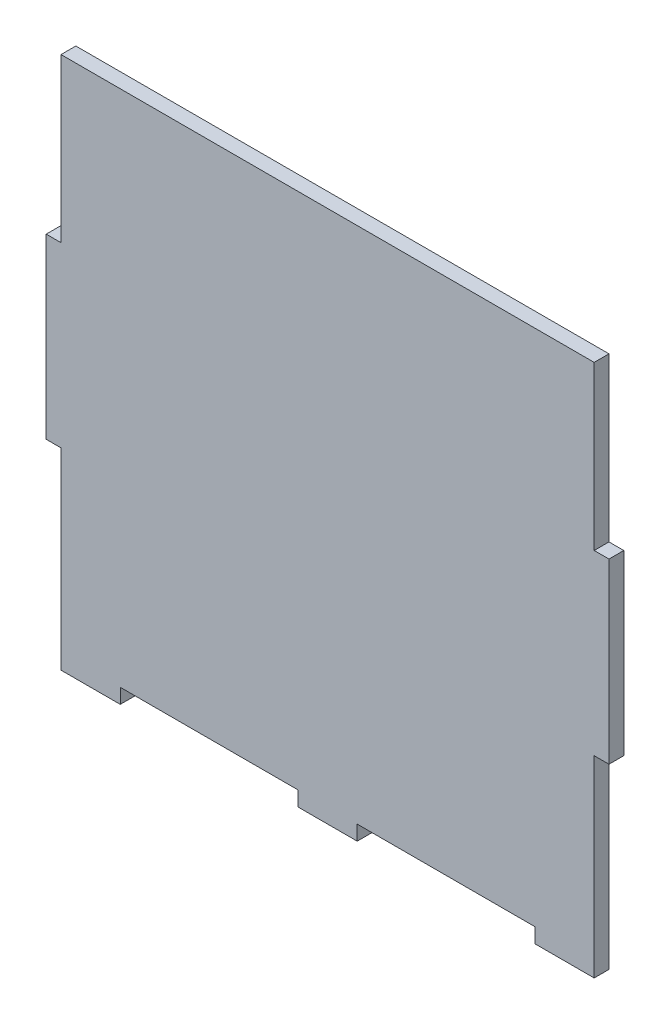
ISO-10303-21;
HEADER;
FILE_DESCRIPTION(('STEP AP214'),'2;1');
FILE_NAME('part.step','',(''),(''),'','','');
FILE_SCHEMA(('AUTOMOTIVE_DESIGN { 1 0 10303 214 1 1 1 1 }'));
ENDSEC;
DATA;
#1=APPLICATION_CONTEXT('core data for automotive mechanical design processes');
#2=APPLICATION_PROTOCOL_DEFINITION('international standard','automotive_design',2000,#1);
#3=PRODUCT_CONTEXT('',#1,'mechanical');
#4=PRODUCT('Part','Part','',(#3));
#5=PRODUCT_RELATED_PRODUCT_CATEGORY('part','',(#4));
#6=PRODUCT_DEFINITION_FORMATION('','',#4);
#7=PRODUCT_DEFINITION_CONTEXT('part definition',#1,'design');
#8=PRODUCT_DEFINITION('design','',#6,#7);
#9=PRODUCT_DEFINITION_SHAPE('','',#8);
#10=(LENGTH_UNIT() NAMED_UNIT(*) SI_UNIT(.MILLI.,.METRE.));
#11=(NAMED_UNIT(*) PLANE_ANGLE_UNIT() SI_UNIT($,.RADIAN.));
#12=(NAMED_UNIT(*) SI_UNIT($,.STERADIAN.) SOLID_ANGLE_UNIT());
#13=UNCERTAINTY_MEASURE_WITH_UNIT(LENGTH_MEASURE(1.E-05),#10,'distance_accuracy_value','');
#14=(GEOMETRIC_REPRESENTATION_CONTEXT(3) GLOBAL_UNCERTAINTY_ASSIGNED_CONTEXT((#13)) GLOBAL_UNIT_ASSIGNED_CONTEXT((#10,
#11,#12)) REPRESENTATION_CONTEXT('',''));
#15=CARTESIAN_POINT('',(0.,0.,0.));
#16=DIRECTION('',(0.,0.,1.));
#17=DIRECTION('',(1.,0.,0.));
#18=AXIS2_PLACEMENT_3D('',#15,#16,#17);
#19=CARTESIAN_POINT('',(0.,-47.38624,6.35));
#20=DIRECTION('',(0.,-1.,0.));
#21=DIRECTION('',(1.,0.,0.));
#22=AXIS2_PLACEMENT_3D('',#19,#20,#21);
#23=PLANE('',#22);
#24=DIRECTION('',(-1.,0.,0.));
#25=VECTOR('',#24,1.);
#26=CARTESIAN_POINT('',(0.,-47.38624,0.));
#27=LINE('',#26,#25);
#28=CARTESIAN_POINT('',(118.491,-47.3862400000001,0.));
#29=VERTEX_POINT('',#28);
#30=CARTESIAN_POINT('',(93.091,-47.3862400000001,0.));
#31=VERTEX_POINT('',#30);
#32=EDGE_CURVE('E203',#29,#31,#27,.T.);
#33=ORIENTED_EDGE('',*,*,#32,.F.);
#34=DIRECTION('',(0.,0.,-1.));
#35=VECTOR('',#34,1.);
#36=CARTESIAN_POINT('',(118.491,-47.3862400000001,6.35));
#37=LINE('',#36,#35);
#38=CARTESIAN_POINT('',(118.491,-47.3862400000001,6.35));
#39=VERTEX_POINT('',#38);
#40=EDGE_CURVE('E11',#39,#29,#37,.T.);
#41=ORIENTED_EDGE('',*,*,#40,.F.);
#42=DIRECTION('',(-1.,0.,0.));
#43=VECTOR('',#42,1.);
#44=CARTESIAN_POINT('',(0.,-47.38624,6.35));
#45=LINE('',#44,#43);
#46=CARTESIAN_POINT('',(93.091,-47.3862400000001,6.35));
#47=VERTEX_POINT('',#46);
#48=EDGE_CURVE('E250',#39,#47,#45,.T.);
#49=ORIENTED_EDGE('',*,*,#48,.T.);
#50=DIRECTION('',(0.,0.,-1.));
#51=VECTOR('',#50,1.);
#52=CARTESIAN_POINT('',(93.091,-47.3862400000001,6.35));
#53=LINE('',#52,#51);
#54=EDGE_CURVE('E53',#47,#31,#53,.T.);
#55=ORIENTED_EDGE('',*,*,#54,.T.);
#56=EDGE_LOOP('',(#33,#41,#49,#55));
#57=FACE_BOUND('',#56,.T.);
#58=ADVANCED_FACE('F37',(#57),#23,.T.);
#59=CARTESIAN_POINT('',(118.491,0.,6.35));
#60=DIRECTION('',(1.,0.,0.));
#61=DIRECTION('',(0.,1.,0.));
#62=AXIS2_PLACEMENT_3D('',#59,#60,#61);
#63=PLANE('',#62);
#64=DIRECTION('',(0.,-1.,0.));
#65=VECTOR('',#64,1.);
#66=CARTESIAN_POINT('',(118.491,0.,0.));
#67=LINE('',#66,#65);
#68=CARTESIAN_POINT('',(118.491,35.16376,0.));
#69=VERTEX_POINT('',#68);
#70=EDGE_CURVE('E205',#69,#29,#67,.T.);
#71=ORIENTED_EDGE('',*,*,#70,.F.);
#72=DIRECTION('',(0.,0.,-1.));
#73=VECTOR('',#72,1.);
#74=CARTESIAN_POINT('',(118.491,35.16376,6.35));
#75=LINE('',#74,#73);
#76=CARTESIAN_POINT('',(118.491,35.16376,6.35));
#77=VERTEX_POINT('',#76);
#78=EDGE_CURVE('E45',#77,#69,#75,.T.);
#79=ORIENTED_EDGE('',*,*,#78,.F.);
#80=DIRECTION('',(0.,-1.,0.));
#81=VECTOR('',#80,1.);
#82=CARTESIAN_POINT('',(118.491,0.,6.35));
#83=LINE('',#82,#81);
#84=EDGE_CURVE('E308',#77,#39,#83,.T.);
#85=ORIENTED_EDGE('',*,*,#84,.T.);
#86=ORIENTED_EDGE('',*,*,#40,.T.);
#87=EDGE_LOOP('',(#71,#79,#85,#86));
#88=FACE_BOUND('',#87,.T.);
#89=ADVANCED_FACE('F296',(#88),#63,.T.);
#90=CARTESIAN_POINT('',(0.,35.16376,6.35));
#91=DIRECTION('',(0.,-1.,0.));
#92=DIRECTION('',(0.,0.,-1.));
#93=AXIS2_PLACEMENT_3D('',#90,#91,#92);
#94=PLANE('',#93);
#95=DIRECTION('',(-1.,0.,0.));
#96=VECTOR('',#95,1.);
#97=CARTESIAN_POINT('',(0.,35.16376,0.));
#98=LINE('',#97,#96);
#99=CARTESIAN_POINT('',(124.841,35.16376,0.));
#100=VERTEX_POINT('',#99);
#101=EDGE_CURVE('E208',#100,#69,#98,.T.);
#102=ORIENTED_EDGE('',*,*,#101,.F.);
#103=DIRECTION('',(0.,0.,-1.));
#104=VECTOR('',#103,1.);
#105=CARTESIAN_POINT('',(124.841,35.16376,6.35));
#106=LINE('',#105,#104);
#107=CARTESIAN_POINT('',(124.841,35.16376,6.35));
#108=VERTEX_POINT('',#107);
#109=EDGE_CURVE('E285',#108,#100,#106,.T.);
#110=ORIENTED_EDGE('',*,*,#109,.F.);
#111=DIRECTION('',(-1.,0.,0.));
#112=VECTOR('',#111,1.);
#113=CARTESIAN_POINT('',(0.,35.16376,6.35));
#114=LINE('',#113,#112);
#115=EDGE_CURVE('E292',#108,#77,#114,.T.);
#116=ORIENTED_EDGE('',*,*,#115,.T.);
#117=ORIENTED_EDGE('',*,*,#78,.T.);
#118=EDGE_LOOP('',(#102,#110,#116,#117));
#119=FACE_BOUND('',#118,.T.);
#120=ADVANCED_FACE('F290',(#119),#94,.T.);
#121=CARTESIAN_POINT('',(124.841,0.,6.35));
#122=DIRECTION('',(1.,0.,0.));
#123=DIRECTION('',(0.,1.,0.));
#124=AXIS2_PLACEMENT_3D('',#121,#122,#123);
#125=PLANE('',#124);
#126=DIRECTION('',(0.,-1.,0.));
#127=VECTOR('',#126,1.);
#128=CARTESIAN_POINT('',(124.841,0.,0.));
#129=LINE('',#128,#127);
#130=CARTESIAN_POINT('',(124.841,111.36376,0.));
#131=VERTEX_POINT('',#130);
#132=EDGE_CURVE('E212',#131,#100,#129,.T.);
#133=ORIENTED_EDGE('',*,*,#132,.F.);
#134=DIRECTION('',(0.,0.,-1.));
#135=VECTOR('',#134,1.);
#136=CARTESIAN_POINT('',(124.841,111.36376,6.35));
#137=LINE('',#136,#135);
#138=CARTESIAN_POINT('',(124.841,111.36376,6.35));
#139=VERTEX_POINT('',#138);
#140=EDGE_CURVE('E283',#139,#131,#137,.T.);
#141=ORIENTED_EDGE('',*,*,#140,.F.);
#142=DIRECTION('',(0.,-1.,0.));
#143=VECTOR('',#142,1.);
#144=CARTESIAN_POINT('',(124.841,0.,6.35));
#145=LINE('',#144,#143);
#146=EDGE_CURVE('E307',#139,#108,#145,.T.);
#147=ORIENTED_EDGE('',*,*,#146,.T.);
#148=ORIENTED_EDGE('',*,*,#109,.T.);
#149=EDGE_LOOP('',(#133,#141,#147,#148));
#150=FACE_BOUND('',#149,.T.);
#151=ADVANCED_FACE('F303',(#150),#125,.T.);
#152=CARTESIAN_POINT('',(0.,111.36376,6.35));
#153=DIRECTION('',(0.,-1.,0.));
#154=DIRECTION('',(0.,0.,-1.));
#155=AXIS2_PLACEMENT_3D('',#152,#153,#154);
#156=PLANE('',#155);
#157=DIRECTION('',(-1.,0.,0.));
#158=VECTOR('',#157,1.);
#159=CARTESIAN_POINT('',(0.,111.36376,0.));
#160=LINE('',#159,#158);
#161=CARTESIAN_POINT('',(118.491,111.36376,0.));
#162=VERTEX_POINT('',#161);
#163=EDGE_CURVE('E215',#131,#162,#160,.T.);
#164=ORIENTED_EDGE('',*,*,#163,.T.);
#165=DIRECTION('',(0.,0.,-1.));
#166=VECTOR('',#165,1.);
#167=CARTESIAN_POINT('',(118.491,111.36376,6.35));
#168=LINE('',#167,#166);
#169=CARTESIAN_POINT('',(118.491,111.36376,6.35));
#170=VERTEX_POINT('',#169);
#171=EDGE_CURVE('E281',#170,#162,#168,.T.);
#172=ORIENTED_EDGE('',*,*,#171,.F.);
#173=DIRECTION('',(-1.,0.,0.));
#174=VECTOR('',#173,1.);
#175=CARTESIAN_POINT('',(0.,111.36376,6.35));
#176=LINE('',#175,#174);
#177=EDGE_CURVE('E310',#139,#170,#176,.T.);
#178=ORIENTED_EDGE('',*,*,#177,.F.);
#179=ORIENTED_EDGE('',*,*,#140,.T.);
#180=EDGE_LOOP('',(#164,#172,#178,#179));
#181=FACE_BOUND('',#180,.T.);
#182=ADVANCED_FACE('F509',(#181),#156,.F.);
#183=CARTESIAN_POINT('',(118.491,181.21376,0.));
#184=VERTEX_POINT('',#183);
#185=EDGE_CURVE('E209',#184,#162,#67,.T.);
#186=ORIENTED_EDGE('',*,*,#185,.F.);
#187=DIRECTION('',(0.,0.,-1.));
#188=VECTOR('',#187,1.);
#189=CARTESIAN_POINT('',(118.491,181.21376,6.35));
#190=LINE('',#189,#188);
#191=CARTESIAN_POINT('',(118.491,181.21376,6.35));
#192=VERTEX_POINT('',#191);
#193=EDGE_CURVE('E279',#192,#184,#190,.T.);
#194=ORIENTED_EDGE('',*,*,#193,.F.);
#195=EDGE_CURVE('E313',#192,#170,#83,.T.);
#196=ORIENTED_EDGE('',*,*,#195,.T.);
#197=ORIENTED_EDGE('',*,*,#171,.T.);
#198=EDGE_LOOP('',(#186,#194,#196,#197));
#199=FACE_BOUND('',#198,.T.);
#200=ADVANCED_FACE('F365',(#199),#63,.T.);
#201=CARTESIAN_POINT('',(0.,181.21376,6.35));
#202=DIRECTION('',(0.,1.,0.));
#203=DIRECTION('',(0.,0.,1.));
#204=AXIS2_PLACEMENT_3D('',#201,#202,#203);
#205=PLANE('',#204);
#206=DIRECTION('',(1.,0.,0.));
#207=VECTOR('',#206,1.);
#208=CARTESIAN_POINT('',(0.,181.21376,0.));
#209=LINE('',#208,#207);
#210=CARTESIAN_POINT('',(-110.109,181.21376,0.));
#211=VERTEX_POINT('',#210);
#212=EDGE_CURVE('E218',#211,#184,#209,.T.);
#213=ORIENTED_EDGE('',*,*,#212,.F.);
#214=DIRECTION('',(0.,0.,-1.));
#215=VECTOR('',#214,1.);
#216=CARTESIAN_POINT('',(-110.109,181.21376,6.35));
#217=LINE('',#216,#215);
#218=CARTESIAN_POINT('',(-110.109,181.21376,6.35));
#219=VERTEX_POINT('',#218);
#220=EDGE_CURVE('E277',#219,#211,#217,.T.);
#221=ORIENTED_EDGE('',*,*,#220,.F.);
#222=DIRECTION('',(1.,0.,0.));
#223=VECTOR('',#222,1.);
#224=CARTESIAN_POINT('',(0.,181.21376,6.35));
#225=LINE('',#224,#223);
#226=EDGE_CURVE('E317',#219,#192,#225,.T.);
#227=ORIENTED_EDGE('',*,*,#226,.T.);
#228=ORIENTED_EDGE('',*,*,#193,.T.);
#229=EDGE_LOOP('',(#213,#221,#227,#228));
#230=FACE_BOUND('',#229,.T.);
#231=ADVANCED_FACE('F491',(#230),#205,.T.);
#232=CARTESIAN_POINT('',(-110.109,0.,6.35));
#233=DIRECTION('',(1.,0.,0.));
#234=DIRECTION('',(0.,1.,0.));
#235=AXIS2_PLACEMENT_3D('',#232,#233,#234);
#236=PLANE('',#235);
#237=DIRECTION('',(0.,-1.,0.));
#238=VECTOR('',#237,1.);
#239=CARTESIAN_POINT('',(-110.109,0.,0.));
#240=LINE('',#239,#238);
#241=CARTESIAN_POINT('',(-110.109,111.36376,0.));
#242=VERTEX_POINT('',#241);
#243=EDGE_CURVE('E221',#211,#242,#240,.T.);
#244=ORIENTED_EDGE('',*,*,#243,.T.);
#245=DIRECTION('',(0.,0.,-1.));
#246=VECTOR('',#245,1.);
#247=CARTESIAN_POINT('',(-110.109,111.36376,6.35));
#248=LINE('',#247,#246);
#249=CARTESIAN_POINT('',(-110.109,111.36376,6.35));
#250=VERTEX_POINT('',#249);
#251=EDGE_CURVE('E275',#250,#242,#248,.T.);
#252=ORIENTED_EDGE('',*,*,#251,.F.);
#253=DIRECTION('',(0.,-1.,0.));
#254=VECTOR('',#253,1.);
#255=CARTESIAN_POINT('',(-110.109,0.,6.35));
#256=LINE('',#255,#254);
#257=EDGE_CURVE('E320',#219,#250,#256,.T.);
#258=ORIENTED_EDGE('',*,*,#257,.F.);
#259=ORIENTED_EDGE('',*,*,#220,.T.);
#260=EDGE_LOOP('',(#244,#252,#258,#259));
#261=FACE_BOUND('',#260,.T.);
#262=ADVANCED_FACE('F454',(#261),#236,.F.);
#263=CARTESIAN_POINT('',(0.,111.36376,6.35));
#264=DIRECTION('',(0.,1.,0.));
#265=DIRECTION('',(0.,0.,1.));
#266=AXIS2_PLACEMENT_3D('',#263,#264,#265);
#267=PLANE('',#266);
#268=DIRECTION('',(1.,0.,0.));
#269=VECTOR('',#268,1.);
#270=CARTESIAN_POINT('',(0.,111.36376,0.));
#271=LINE('',#270,#269);
#272=CARTESIAN_POINT('',(-116.459,111.36376,0.));
#273=VERTEX_POINT('',#272);
#274=EDGE_CURVE('E224',#273,#242,#271,.T.);
#275=ORIENTED_EDGE('',*,*,#274,.F.);
#276=DIRECTION('',(0.,0.,-1.));
#277=VECTOR('',#276,1.);
#278=CARTESIAN_POINT('',(-116.459,111.36376,6.35));
#279=LINE('',#278,#277);
#280=CARTESIAN_POINT('',(-116.459,111.36376,6.35));
#281=VERTEX_POINT('',#280);
#282=EDGE_CURVE('E273',#281,#273,#279,.T.);
#283=ORIENTED_EDGE('',*,*,#282,.F.);
#284=DIRECTION('',(1.,0.,0.));
#285=VECTOR('',#284,1.);
#286=CARTESIAN_POINT('',(0.,111.36376,6.35));
#287=LINE('',#286,#285);
#288=EDGE_CURVE('E322',#281,#250,#287,.T.);
#289=ORIENTED_EDGE('',*,*,#288,.T.);
#290=ORIENTED_EDGE('',*,*,#251,.T.);
#291=EDGE_LOOP('',(#275,#283,#289,#290));
#292=FACE_BOUND('',#291,.T.);
#293=ADVANCED_FACE('F472',(#292),#267,.T.);
#294=CARTESIAN_POINT('',(-116.459,0.,6.35));
#295=DIRECTION('',(1.,0.,0.));
#296=DIRECTION('',(0.,1.,0.));
#297=AXIS2_PLACEMENT_3D('',#294,#295,#296);
#298=PLANE('',#297);
#299=DIRECTION('',(0.,-1.,0.));
#300=VECTOR('',#299,1.);
#301=CARTESIAN_POINT('',(-116.459,0.,0.));
#302=LINE('',#301,#300);
#303=CARTESIAN_POINT('',(-116.459,35.1637599999999,0.));
#304=VERTEX_POINT('',#303);
#305=EDGE_CURVE('E228',#273,#304,#302,.T.);
#306=ORIENTED_EDGE('',*,*,#305,.T.);
#307=DIRECTION('',(0.,0.,-1.));
#308=VECTOR('',#307,1.);
#309=CARTESIAN_POINT('',(-116.459,35.1637599999999,6.35));
#310=LINE('',#309,#308);
#311=CARTESIAN_POINT('',(-116.459,35.1637599999999,6.35));
#312=VERTEX_POINT('',#311);
#313=EDGE_CURVE('E270',#312,#304,#310,.T.);
#314=ORIENTED_EDGE('',*,*,#313,.F.);
#315=DIRECTION('',(0.,-1.,0.));
#316=VECTOR('',#315,1.);
#317=CARTESIAN_POINT('',(-116.459,0.,6.35));
#318=LINE('',#317,#316);
#319=EDGE_CURVE('E326',#281,#312,#318,.T.);
#320=ORIENTED_EDGE('',*,*,#319,.F.);
#321=ORIENTED_EDGE('',*,*,#282,.T.);
#322=EDGE_LOOP('',(#306,#314,#320,#321));
#323=FACE_BOUND('',#322,.T.);
#324=ADVANCED_FACE('F462',(#323),#298,.F.);
#325=CARTESIAN_POINT('',(0.,35.1637599999999,6.35));
#326=DIRECTION('',(0.,1.,0.));
#327=DIRECTION('',(0.,0.,1.));
#328=AXIS2_PLACEMENT_3D('',#325,#326,#327);
#329=PLANE('',#328);
#330=DIRECTION('',(1.,0.,0.));
#331=VECTOR('',#330,1.);
#332=CARTESIAN_POINT('',(0.,35.1637599999999,0.));
#333=LINE('',#332,#331);
#334=CARTESIAN_POINT('',(-110.109,35.1637599999999,0.));
#335=VERTEX_POINT('',#334);
#336=EDGE_CURVE('E230',#304,#335,#333,.T.);
#337=ORIENTED_EDGE('',*,*,#336,.T.);
#338=DIRECTION('',(0.,0.,-1.));
#339=VECTOR('',#338,1.);
#340=CARTESIAN_POINT('',(-110.109,35.1637599999999,6.35));
#341=LINE('',#340,#339);
#342=CARTESIAN_POINT('',(-110.109,35.1637599999999,6.35));
#343=VERTEX_POINT('',#342);
#344=EDGE_CURVE('E267',#343,#335,#341,.T.);
#345=ORIENTED_EDGE('',*,*,#344,.F.);
#346=DIRECTION('',(1.,0.,0.));
#347=VECTOR('',#346,1.);
#348=CARTESIAN_POINT('',(0.,35.1637599999999,6.35));
#349=LINE('',#348,#347);
#350=EDGE_CURVE('E328',#312,#343,#349,.T.);
#351=ORIENTED_EDGE('',*,*,#350,.F.);
#352=ORIENTED_EDGE('',*,*,#313,.T.);
#353=EDGE_LOOP('',(#337,#345,#351,#352));
#354=FACE_BOUND('',#353,.T.);
#355=ADVANCED_FACE('F451',(#354),#329,.F.);
#356=CARTESIAN_POINT('',(-110.109,-47.3862400000001,0.));
#357=VERTEX_POINT('',#356);
#358=EDGE_CURVE('E225',#335,#357,#240,.T.);
#359=ORIENTED_EDGE('',*,*,#358,.T.);
#360=DIRECTION('',(0.,0.,-1.));
#361=VECTOR('',#360,1.);
#362=CARTESIAN_POINT('',(-110.109,-47.3862400000001,6.35));
#363=LINE('',#362,#361);
#364=CARTESIAN_POINT('',(-110.109,-47.3862400000001,6.35));
#365=VERTEX_POINT('',#364);
#366=EDGE_CURVE('E264',#365,#357,#363,.T.);
#367=ORIENTED_EDGE('',*,*,#366,.F.);
#368=EDGE_CURVE('E323',#343,#365,#256,.T.);
#369=ORIENTED_EDGE('',*,*,#368,.F.);
#370=ORIENTED_EDGE('',*,*,#344,.T.);
#371=EDGE_LOOP('',(#359,#367,#369,#370));
#372=FACE_BOUND('',#371,.T.);
#373=ADVANCED_FACE('F441',(#372),#236,.F.);
#374=CARTESIAN_POINT('',(0.,-47.3862400000001,6.35));
#375=DIRECTION('',(0.,1.,0.));
#376=DIRECTION('',(0.,0.,1.));
#377=AXIS2_PLACEMENT_3D('',#374,#375,#376);
#378=PLANE('',#377);
#379=DIRECTION('',(1.,0.,0.));
#380=VECTOR('',#379,1.);
#381=CARTESIAN_POINT('',(0.,-47.3862400000001,0.));
#382=LINE('',#381,#380);
#383=CARTESIAN_POINT('',(-84.709,-47.3862400000001,0.));
#384=VERTEX_POINT('',#383);
#385=EDGE_CURVE('E232',#357,#384,#382,.T.);
#386=ORIENTED_EDGE('',*,*,#385,.T.);
#387=DIRECTION('',(0.,0.,-1.));
#388=VECTOR('',#387,1.);
#389=CARTESIAN_POINT('',(-84.709,-47.3862400000001,6.35));
#390=LINE('',#389,#388);
#391=CARTESIAN_POINT('',(-84.709,-47.3862400000001,6.35));
#392=VERTEX_POINT('',#391);
#393=EDGE_CURVE('E261',#392,#384,#390,.T.);
#394=ORIENTED_EDGE('',*,*,#393,.F.);
#395=DIRECTION('',(1.,0.,0.));
#396=VECTOR('',#395,1.);
#397=CARTESIAN_POINT('',(0.,-47.3862400000001,6.35));
#398=LINE('',#397,#396);
#399=EDGE_CURVE('E330',#365,#392,#398,.T.);
#400=ORIENTED_EDGE('',*,*,#399,.F.);
#401=ORIENTED_EDGE('',*,*,#366,.T.);
#402=EDGE_LOOP('',(#386,#394,#400,#401));
#403=FACE_BOUND('',#402,.T.);
#404=ADVANCED_FACE('F431',(#403),#378,.F.);
#405=CARTESIAN_POINT('',(-84.709,0.,6.35));
#406=DIRECTION('',(-1.,0.,0.));
#407=DIRECTION('',(0.,0.,1.));
#408=AXIS2_PLACEMENT_3D('',#405,#406,#407);
#409=PLANE('',#408);
#410=DIRECTION('',(0.,1.,0.));
#411=VECTOR('',#410,1.);
#412=CARTESIAN_POINT('',(-84.709,0.,0.));
#413=LINE('',#412,#411);
#414=CARTESIAN_POINT('',(-84.709,-41.0362400000001,0.));
#415=VERTEX_POINT('',#414);
#416=EDGE_CURVE('E234',#384,#415,#413,.T.);
#417=ORIENTED_EDGE('',*,*,#416,.T.);
#418=DIRECTION('',(0.,0.,-1.));
#419=VECTOR('',#418,1.);
#420=CARTESIAN_POINT('',(-84.709,-41.0362400000001,6.35));
#421=LINE('',#420,#419);
#422=CARTESIAN_POINT('',(-84.709,-41.0362400000001,6.35));
#423=VERTEX_POINT('',#422);
#424=EDGE_CURVE('E258',#423,#415,#421,.T.);
#425=ORIENTED_EDGE('',*,*,#424,.F.);
#426=DIRECTION('',(0.,1.,0.));
#427=VECTOR('',#426,1.);
#428=CARTESIAN_POINT('',(-84.709,0.,6.35));
#429=LINE('',#428,#427);
#430=EDGE_CURVE('E332',#392,#423,#429,.T.);
#431=ORIENTED_EDGE('',*,*,#430,.F.);
#432=ORIENTED_EDGE('',*,*,#393,.T.);
#433=EDGE_LOOP('',(#417,#425,#431,#432));
#434=FACE_BOUND('',#433,.T.);
#435=ADVANCED_FACE('F422',(#434),#409,.F.);
#436=CARTESIAN_POINT('',(0.,-41.0362400000001,6.35));
#437=DIRECTION('',(0.,1.,0.));
#438=DIRECTION('',(0.,0.,1.));
#439=AXIS2_PLACEMENT_3D('',#436,#437,#438);
#440=PLANE('',#439);
#441=DIRECTION('',(1.,0.,0.));
#442=VECTOR('',#441,1.);
#443=CARTESIAN_POINT('',(0.,-41.0362400000001,0.));
#444=LINE('',#443,#442);
#445=CARTESIAN_POINT('',(-8.509,-41.0362400000001,0.));
#446=VERTEX_POINT('',#445);
#447=EDGE_CURVE('E236',#415,#446,#444,.T.);
#448=ORIENTED_EDGE('',*,*,#447,.T.);
#449=DIRECTION('',(0.,0.,-1.));
#450=VECTOR('',#449,1.);
#451=CARTESIAN_POINT('',(-8.509,-41.0362400000001,6.35));
#452=LINE('',#451,#450);
#453=CARTESIAN_POINT('',(-8.509,-41.0362400000001,6.35));
#454=VERTEX_POINT('',#453);
#455=EDGE_CURVE('E256',#454,#446,#452,.T.);
#456=ORIENTED_EDGE('',*,*,#455,.F.);
#457=DIRECTION('',(1.,0.,0.));
#458=VECTOR('',#457,1.);
#459=CARTESIAN_POINT('',(0.,-41.0362400000001,6.35));
#460=LINE('',#459,#458);
#461=EDGE_CURVE('E334',#423,#454,#460,.T.);
#462=ORIENTED_EDGE('',*,*,#461,.F.);
#463=ORIENTED_EDGE('',*,*,#424,.T.);
#464=EDGE_LOOP('',(#448,#456,#462,#463));
#465=FACE_BOUND('',#464,.T.);
#466=ADVANCED_FACE('F346',(#465),#440,.F.);
#467=CARTESIAN_POINT('',(-8.50900000000001,0.,6.35));
#468=DIRECTION('',(-1.,0.,0.));
#469=DIRECTION('',(0.,-1.,0.));
#470=AXIS2_PLACEMENT_3D('',#467,#468,#469);
#471=PLANE('',#470);
#472=DIRECTION('',(0.,1.,0.));
#473=VECTOR('',#472,1.);
#474=CARTESIAN_POINT('',(-8.50900000000001,0.,0.));
#475=LINE('',#474,#473);
#476=CARTESIAN_POINT('',(-8.509,-47.38624,0.));
#477=VERTEX_POINT('',#476);
#478=EDGE_CURVE('E239',#477,#446,#475,.T.);
#479=ORIENTED_EDGE('',*,*,#478,.F.);
#480=DIRECTION('',(0.,0.,-1.));
#481=VECTOR('',#480,1.);
#482=CARTESIAN_POINT('',(-8.509,-47.38624,6.35));
#483=LINE('',#482,#481);
#484=CARTESIAN_POINT('',(-8.509,-47.38624,6.35));
#485=VERTEX_POINT('',#484);
#486=EDGE_CURVE('E254',#485,#477,#483,.T.);
#487=ORIENTED_EDGE('',*,*,#486,.F.);
#488=DIRECTION('',(0.,1.,0.));
#489=VECTOR('',#488,1.);
#490=CARTESIAN_POINT('',(-8.50900000000001,0.,6.35));
#491=LINE('',#490,#489);
#492=EDGE_CURVE('E336',#485,#454,#491,.T.);
#493=ORIENTED_EDGE('',*,*,#492,.T.);
#494=ORIENTED_EDGE('',*,*,#455,.T.);
#495=EDGE_LOOP('',(#479,#487,#493,#494));
#496=FACE_BOUND('',#495,.T.);
#497=ADVANCED_FACE('F340',(#496),#471,.T.);
#498=CARTESIAN_POINT('',(0.,-47.38624,6.35));
#499=DIRECTION('',(0.,1.,0.));
#500=DIRECTION('',(0.,0.,1.));
#501=AXIS2_PLACEMENT_3D('',#498,#499,#500);
#502=PLANE('',#501);
#503=DIRECTION('',(1.,0.,0.));
#504=VECTOR('',#503,1.);
#505=CARTESIAN_POINT('',(0.,-47.38624,0.));
#506=LINE('',#505,#504);
#507=CARTESIAN_POINT('',(16.891,-47.38624,0.));
#508=VERTEX_POINT('',#507);
#509=EDGE_CURVE('E242',#477,#508,#506,.T.);
#510=ORIENTED_EDGE('',*,*,#509,.T.);
#511=DIRECTION('',(0.,0.,-1.));
#512=VECTOR('',#511,1.);
#513=CARTESIAN_POINT('',(16.891,-47.38624,6.35));
#514=LINE('',#513,#512);
#515=CARTESIAN_POINT('',(16.891,-47.38624,6.35));
#516=VERTEX_POINT('',#515);
#517=EDGE_CURVE('E195',#516,#508,#514,.T.);
#518=ORIENTED_EDGE('',*,*,#517,.F.);
#519=DIRECTION('',(1.,0.,0.));
#520=VECTOR('',#519,1.);
#521=CARTESIAN_POINT('',(0.,-47.38624,6.35));
#522=LINE('',#521,#520);
#523=EDGE_CURVE('E183',#485,#516,#522,.T.);
#524=ORIENTED_EDGE('',*,*,#523,.F.);
#525=ORIENTED_EDGE('',*,*,#486,.T.);
#526=EDGE_LOOP('',(#510,#518,#524,#525));
#527=FACE_BOUND('',#526,.T.);
#528=ADVANCED_FACE('F351',(#527),#502,.F.);
#529=CARTESIAN_POINT('',(16.891,0.,6.35));
#530=DIRECTION('',(-1.,0.,0.));
#531=DIRECTION('',(0.,0.,1.));
#532=AXIS2_PLACEMENT_3D('',#529,#530,#531);
#533=PLANE('',#532);
#534=DIRECTION('',(0.,1.,0.));
#535=VECTOR('',#534,1.);
#536=CARTESIAN_POINT('',(16.891,0.,0.));
#537=LINE('',#536,#535);
#538=CARTESIAN_POINT('',(16.891,-41.0362400000001,0.));
#539=VERTEX_POINT('',#538);
#540=EDGE_CURVE('E192',#508,#539,#537,.T.);
#541=ORIENTED_EDGE('',*,*,#540,.T.);
#542=DIRECTION('',(0.,0.,-1.));
#543=VECTOR('',#542,1.);
#544=CARTESIAN_POINT('',(16.891,-41.0362400000001,6.35));
#545=LINE('',#544,#543);
#546=CARTESIAN_POINT('',(16.891,-41.0362400000001,6.35));
#547=VERTEX_POINT('',#546);
#548=EDGE_CURVE('E189',#547,#539,#545,.T.);
#549=ORIENTED_EDGE('',*,*,#548,.F.);
#550=DIRECTION('',(0.,1.,0.));
#551=VECTOR('',#550,1.);
#552=CARTESIAN_POINT('',(16.891,0.,6.35));
#553=LINE('',#552,#551);
#554=EDGE_CURVE('E175',#516,#547,#553,.T.);
#555=ORIENTED_EDGE('',*,*,#554,.F.);
#556=ORIENTED_EDGE('',*,*,#517,.T.);
#557=EDGE_LOOP('',(#541,#549,#555,#556));
#558=FACE_BOUND('',#557,.T.);
#559=ADVANCED_FACE('F190',(#558),#533,.F.);
#560=CARTESIAN_POINT('',(0.,-41.0362400000001,6.35));
#561=DIRECTION('',(0.,-1.,0.));
#562=DIRECTION('',(0.,0.,-1.));
#563=AXIS2_PLACEMENT_3D('',#560,#561,#562);
#564=PLANE('',#563);
#565=DIRECTION('',(-1.,0.,0.));
#566=VECTOR('',#565,1.);
#567=CARTESIAN_POINT('',(0.,-41.0362400000001,0.));
#568=LINE('',#567,#566);
#569=CARTESIAN_POINT('',(93.091,-41.0362400000001,0.));
#570=VERTEX_POINT('',#569);
#571=EDGE_CURVE('E245',#570,#539,#568,.T.);
#572=ORIENTED_EDGE('',*,*,#571,.F.);
#573=DIRECTION('',(0.,0.,-1.));
#574=VECTOR('',#573,1.);
#575=CARTESIAN_POINT('',(93.091,-41.0362400000001,6.35));
#576=LINE('',#575,#574);
#577=CARTESIAN_POINT('',(93.091,-41.0362400000001,6.35));
#578=VERTEX_POINT('',#577);
#579=EDGE_CURVE('E114',#578,#570,#576,.T.);
#580=ORIENTED_EDGE('',*,*,#579,.F.);
#581=DIRECTION('',(-1.,0.,0.));
#582=VECTOR('',#581,1.);
#583=CARTESIAN_POINT('',(0.,-41.0362400000001,6.35));
#584=LINE('',#583,#582);
#585=EDGE_CURVE('E180',#578,#547,#584,.T.);
#586=ORIENTED_EDGE('',*,*,#585,.T.);
#587=ORIENTED_EDGE('',*,*,#548,.T.);
#588=EDGE_LOOP('',(#572,#580,#586,#587));
#589=FACE_BOUND('',#588,.T.);
#590=ADVANCED_FACE('F197',(#589),#564,.T.);
#591=CARTESIAN_POINT('',(93.091,0.,6.35));
#592=DIRECTION('',(-1.,0.,0.));
#593=DIRECTION('',(0.,0.,1.));
#594=AXIS2_PLACEMENT_3D('',#591,#592,#593);
#595=PLANE('',#594);
#596=DIRECTION('',(0.,1.,0.));
#597=VECTOR('',#596,1.);
#598=CARTESIAN_POINT('',(93.091,0.,0.));
#599=LINE('',#598,#597);
#600=EDGE_CURVE('E247',#31,#570,#599,.T.);
#601=ORIENTED_EDGE('',*,*,#600,.F.);
#602=ORIENTED_EDGE('',*,*,#54,.F.);
#603=DIRECTION('',(0.,1.,0.));
#604=VECTOR('',#603,1.);
#605=CARTESIAN_POINT('',(93.091,0.,6.35));
#606=LINE('',#605,#604);
#607=EDGE_CURVE('E198',#47,#578,#606,.T.);
#608=ORIENTED_EDGE('',*,*,#607,.T.);
#609=ORIENTED_EDGE('',*,*,#579,.T.);
#610=EDGE_LOOP('',(#601,#602,#608,#609));
#611=FACE_BOUND('',#610,.T.);
#612=ADVANCED_FACE('F366',(#611),#595,.T.);
#613=CARTESIAN_POINT('',(0.,0.,6.35));
#614=DIRECTION('',(0.,0.,1.));
#615=DIRECTION('',(1.,0.,0.));
#616=AXIS2_PLACEMENT_3D('',#613,#614,#615);
#617=PLANE('',#616);
#618=ORIENTED_EDGE('',*,*,#48,.F.);
#619=ORIENTED_EDGE('',*,*,#84,.F.);
#620=ORIENTED_EDGE('',*,*,#115,.F.);
#621=ORIENTED_EDGE('',*,*,#146,.F.);
#622=ORIENTED_EDGE('',*,*,#177,.T.);
#623=ORIENTED_EDGE('',*,*,#195,.F.);
#624=ORIENTED_EDGE('',*,*,#226,.F.);
#625=ORIENTED_EDGE('',*,*,#257,.T.);
#626=ORIENTED_EDGE('',*,*,#288,.F.);
#627=ORIENTED_EDGE('',*,*,#319,.T.);
#628=ORIENTED_EDGE('',*,*,#350,.T.);
#629=ORIENTED_EDGE('',*,*,#368,.T.);
#630=ORIENTED_EDGE('',*,*,#399,.T.);
#631=ORIENTED_EDGE('',*,*,#430,.T.);
#632=ORIENTED_EDGE('',*,*,#461,.T.);
#633=ORIENTED_EDGE('',*,*,#492,.F.);
#634=ORIENTED_EDGE('',*,*,#523,.T.);
#635=ORIENTED_EDGE('',*,*,#554,.T.);
#636=ORIENTED_EDGE('',*,*,#585,.F.);
#637=ORIENTED_EDGE('',*,*,#607,.F.);
#638=EDGE_LOOP('',(#618,#619,#620,#621,#622,#623,#624,#625,#626,#627,#628,#629,#630,#631,#632,
#633,#634,#635,#636,#637));
#639=FACE_BOUND('',#638,.T.);
#640=ADVANCED_FACE('F177',(#639),#617,.T.);
#641=CARTESIAN_POINT('',(0.,0.,0.));
#642=DIRECTION('',(0.,0.,1.));
#643=DIRECTION('',(1.,0.,0.));
#644=AXIS2_PLACEMENT_3D('',#641,#642,#643);
#645=PLANE('',#644);
#646=ORIENTED_EDGE('',*,*,#32,.T.);
#647=ORIENTED_EDGE('',*,*,#600,.T.);
#648=ORIENTED_EDGE('',*,*,#571,.T.);
#649=ORIENTED_EDGE('',*,*,#540,.F.);
#650=ORIENTED_EDGE('',*,*,#509,.F.);
#651=ORIENTED_EDGE('',*,*,#478,.T.);
#652=ORIENTED_EDGE('',*,*,#447,.F.);
#653=ORIENTED_EDGE('',*,*,#416,.F.);
#654=ORIENTED_EDGE('',*,*,#385,.F.);
#655=ORIENTED_EDGE('',*,*,#358,.F.);
#656=ORIENTED_EDGE('',*,*,#336,.F.);
#657=ORIENTED_EDGE('',*,*,#305,.F.);
#658=ORIENTED_EDGE('',*,*,#274,.T.);
#659=ORIENTED_EDGE('',*,*,#243,.F.);
#660=ORIENTED_EDGE('',*,*,#212,.T.);
#661=ORIENTED_EDGE('',*,*,#185,.T.);
#662=ORIENTED_EDGE('',*,*,#163,.F.);
#663=ORIENTED_EDGE('',*,*,#132,.T.);
#664=ORIENTED_EDGE('',*,*,#101,.T.);
#665=ORIENTED_EDGE('',*,*,#70,.T.);
#666=EDGE_LOOP('',(#646,#647,#648,#649,#650,#651,#652,#653,#654,#655,#656,#657,#658,#659,#660,
#661,#662,#663,#664,#665));
#667=FACE_BOUND('',#666,.T.);
#668=ADVANCED_FACE('F298',(#667),#645,.F.);
#669=CLOSED_SHELL('',(#58,#89,#120,#151,#182,#200,#231,#262,#293,#324,#355,#373,#404,#435,#466,
#497,#528,#559,#590,#612,#640,#668));
#670=MANIFOLD_SOLID_BREP('B2',#669);
#671=ADVANCED_BREP_SHAPE_REPRESENTATION('',(#18,#670),#14);
#672=SHAPE_DEFINITION_REPRESENTATION(#9,#671);
ENDSEC;
END-ISO-10303-21;
